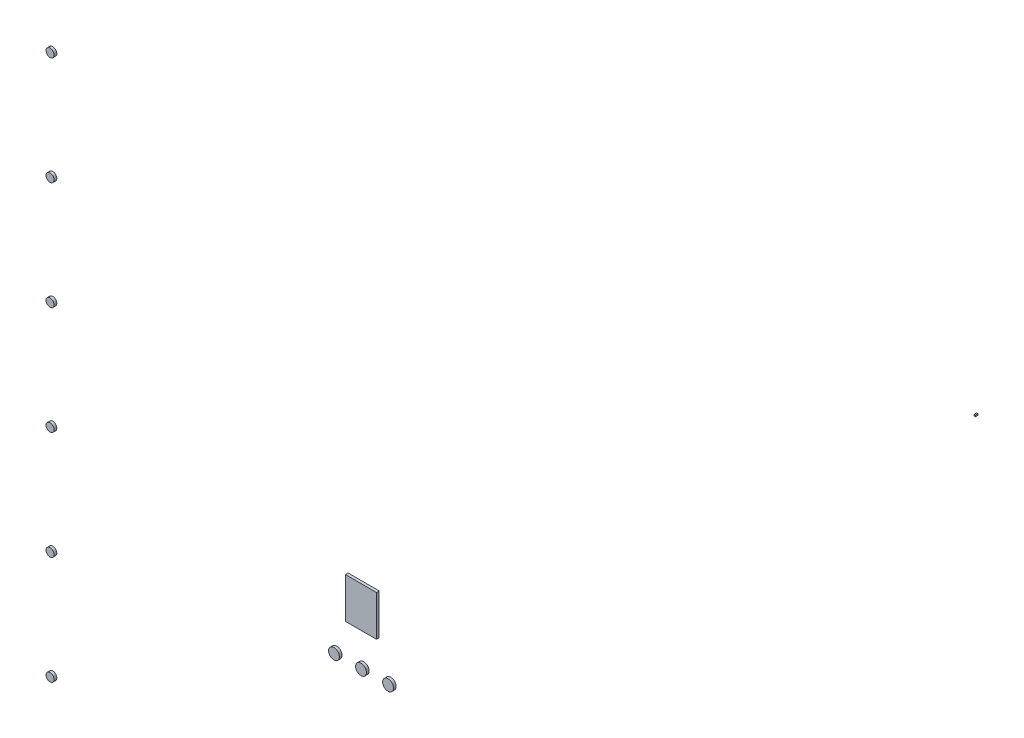
ISO-10303-21;
HEADER;
FILE_DESCRIPTION(('STEP AP214'),'2;1');
FILE_NAME('part.step','',(''),(''),'','','');
FILE_SCHEMA(('AUTOMOTIVE_DESIGN { 1 0 10303 214 1 1 1 1 }'));
ENDSEC;
DATA;
#1=APPLICATION_CONTEXT('core data for automotive mechanical design processes');
#2=APPLICATION_PROTOCOL_DEFINITION('international standard','automotive_design',2000,#1);
#3=PRODUCT_CONTEXT('',#1,'mechanical');
#4=PRODUCT('Part','Part','',(#3));
#5=PRODUCT_RELATED_PRODUCT_CATEGORY('part','',(#4));
#6=PRODUCT_DEFINITION_FORMATION('','',#4);
#7=PRODUCT_DEFINITION_CONTEXT('part definition',#1,'design');
#8=PRODUCT_DEFINITION('design','',#6,#7);
#9=PRODUCT_DEFINITION_SHAPE('','',#8);
#10=(LENGTH_UNIT() NAMED_UNIT(*) SI_UNIT(.MILLI.,.METRE.));
#11=(NAMED_UNIT(*) PLANE_ANGLE_UNIT() SI_UNIT($,.RADIAN.));
#12=(NAMED_UNIT(*) SI_UNIT($,.STERADIAN.) SOLID_ANGLE_UNIT());
#13=UNCERTAINTY_MEASURE_WITH_UNIT(LENGTH_MEASURE(1.E-05),#10,'distance_accuracy_value','');
#14=(GEOMETRIC_REPRESENTATION_CONTEXT(3) GLOBAL_UNCERTAINTY_ASSIGNED_CONTEXT((#13)) GLOBAL_UNIT_ASSIGNED_CONTEXT((#10,
#11,#12)) REPRESENTATION_CONTEXT('',''));
#15=CARTESIAN_POINT('',(0.,0.,0.));
#16=DIRECTION('',(0.,0.,1.));
#17=DIRECTION('',(1.,0.,0.));
#18=AXIS2_PLACEMENT_3D('',#15,#16,#17);
#19=CARTESIAN_POINT('',(0.,569.6,2.));
#20=DIRECTION('',(0.,-1.,0.));
#21=DIRECTION('',(0.,0.,-1.));
#22=AXIS2_PLACEMENT_3D('',#19,#20,#21);
#23=PLANE('',#22);
#24=DIRECTION('',(-1.,0.,0.));
#25=VECTOR('',#24,1.);
#26=CARTESIAN_POINT('',(0.,569.6,0.));
#27=LINE('',#26,#25);
#28=CARTESIAN_POINT('',(924.4,569.6,0.));
#29=VERTEX_POINT('',#28);
#30=CARTESIAN_POINT('',(923.4,569.6,0.));
#31=VERTEX_POINT('',#30);
#32=EDGE_CURVE('E107',#29,#31,#27,.T.);
#33=ORIENTED_EDGE('',*,*,#32,.T.);
#34=DIRECTION('',(0.,0.,-1.));
#35=VECTOR('',#34,1.);
#36=CARTESIAN_POINT('',(923.4,569.6,2.));
#37=LINE('',#36,#35);
#38=CARTESIAN_POINT('',(923.4,569.6,2.));
#39=VERTEX_POINT('',#38);
#40=EDGE_CURVE('E12',#39,#31,#37,.T.);
#41=ORIENTED_EDGE('',*,*,#40,.F.);
#42=DIRECTION('',(-1.,0.,0.));
#43=VECTOR('',#42,1.);
#44=CARTESIAN_POINT('',(0.,569.6,2.));
#45=LINE('',#44,#43);
#46=CARTESIAN_POINT('',(924.4,569.6,2.));
#47=VERTEX_POINT('',#46);
#48=EDGE_CURVE('E93',#47,#39,#45,.T.);
#49=ORIENTED_EDGE('',*,*,#48,.F.);
#50=DIRECTION('',(0.,0.,-1.));
#51=VECTOR('',#50,1.);
#52=CARTESIAN_POINT('',(924.4,569.6,2.));
#53=LINE('',#52,#51);
#54=EDGE_CURVE('E60',#47,#29,#53,.T.);
#55=ORIENTED_EDGE('',*,*,#54,.T.);
#56=EDGE_LOOP('',(#33,#41,#49,#55));
#57=FACE_BOUND('',#56,.T.);
#58=ADVANCED_FACE('F44',(#57),#23,.F.);
#59=CARTESIAN_POINT('',(923.4,0.,2.));
#60=DIRECTION('',(1.,0.,0.));
#61=DIRECTION('',(0.,0.,-1.));
#62=AXIS2_PLACEMENT_3D('',#59,#60,#61);
#63=PLANE('',#62);
#64=DIRECTION('',(0.,-1.,0.));
#65=VECTOR('',#64,1.);
#66=CARTESIAN_POINT('',(923.4,0.,0.));
#67=LINE('',#66,#65);
#68=CARTESIAN_POINT('',(923.4,568.6,0.));
#69=VERTEX_POINT('',#68);
#70=EDGE_CURVE('E98',#31,#69,#67,.T.);
#71=ORIENTED_EDGE('',*,*,#70,.T.);
#72=DIRECTION('',(0.,0.,-1.));
#73=VECTOR('',#72,1.);
#74=CARTESIAN_POINT('',(923.4,568.6,2.));
#75=LINE('',#74,#73);
#76=CARTESIAN_POINT('',(923.4,568.6,2.));
#77=VERTEX_POINT('',#76);
#78=EDGE_CURVE('E52',#77,#69,#75,.T.);
#79=ORIENTED_EDGE('',*,*,#78,.F.);
#80=DIRECTION('',(0.,-1.,0.));
#81=VECTOR('',#80,1.);
#82=CARTESIAN_POINT('',(923.4,0.,2.));
#83=LINE('',#82,#81);
#84=EDGE_CURVE('E85',#39,#77,#83,.T.);
#85=ORIENTED_EDGE('',*,*,#84,.F.);
#86=ORIENTED_EDGE('',*,*,#40,.T.);
#87=EDGE_LOOP('',(#71,#79,#85,#86));
#88=FACE_BOUND('',#87,.T.);
#89=ADVANCED_FACE('F97',(#88),#63,.F.);
#90=CARTESIAN_POINT('',(0.,568.6,2.));
#91=DIRECTION('',(0.,-1.,0.));
#92=DIRECTION('',(0.,0.,-1.));
#93=AXIS2_PLACEMENT_3D('',#90,#91,#92);
#94=PLANE('',#93);
#95=DIRECTION('',(-1.,0.,0.));
#96=VECTOR('',#95,1.);
#97=CARTESIAN_POINT('',(0.,568.6,0.));
#98=LINE('',#97,#96);
#99=CARTESIAN_POINT('',(924.4,568.6,0.));
#100=VERTEX_POINT('',#99);
#101=EDGE_CURVE('E110',#100,#69,#98,.T.);
#102=ORIENTED_EDGE('',*,*,#101,.F.);
#103=DIRECTION('',(0.,0.,-1.));
#104=VECTOR('',#103,1.);
#105=CARTESIAN_POINT('',(924.4,568.6,2.));
#106=LINE('',#105,#104);
#107=CARTESIAN_POINT('',(924.4,568.6,2.));
#108=VERTEX_POINT('',#107);
#109=EDGE_CURVE('E74',#108,#100,#106,.T.);
#110=ORIENTED_EDGE('',*,*,#109,.F.);
#111=DIRECTION('',(-1.,0.,0.));
#112=VECTOR('',#111,1.);
#113=CARTESIAN_POINT('',(0.,568.6,2.));
#114=LINE('',#113,#112);
#115=EDGE_CURVE('E92',#108,#77,#114,.T.);
#116=ORIENTED_EDGE('',*,*,#115,.T.);
#117=ORIENTED_EDGE('',*,*,#78,.T.);
#118=EDGE_LOOP('',(#102,#110,#116,#117));
#119=FACE_BOUND('',#118,.T.);
#120=ADVANCED_FACE('F101',(#119),#94,.T.);
#121=CARTESIAN_POINT('',(924.4,0.,2.));
#122=DIRECTION('',(1.,0.,0.));
#123=DIRECTION('',(0.,0.,-1.));
#124=AXIS2_PLACEMENT_3D('',#121,#122,#123);
#125=PLANE('',#124);
#126=DIRECTION('',(0.,-1.,0.));
#127=VECTOR('',#126,1.);
#128=CARTESIAN_POINT('',(924.4,0.,0.));
#129=LINE('',#128,#127);
#130=EDGE_CURVE('E112',#29,#100,#129,.T.);
#131=ORIENTED_EDGE('',*,*,#130,.F.);
#132=ORIENTED_EDGE('',*,*,#54,.F.);
#133=DIRECTION('',(0.,-1.,0.));
#134=VECTOR('',#133,1.);
#135=CARTESIAN_POINT('',(924.4,0.,2.));
#136=LINE('',#135,#134);
#137=EDGE_CURVE('E102',#47,#108,#136,.T.);
#138=ORIENTED_EDGE('',*,*,#137,.T.);
#139=ORIENTED_EDGE('',*,*,#109,.T.);
#140=EDGE_LOOP('',(#131,#132,#138,#139));
#141=FACE_BOUND('',#140,.T.);
#142=ADVANCED_FACE('F118',(#141),#125,.T.);
#143=CARTESIAN_POINT('',(0.,0.,2.));
#144=DIRECTION('',(0.,0.,1.));
#145=DIRECTION('',(1.,0.,0.));
#146=AXIS2_PLACEMENT_3D('',#143,#144,#145);
#147=PLANE('',#146);
#148=ORIENTED_EDGE('',*,*,#48,.T.);
#149=ORIENTED_EDGE('',*,*,#84,.T.);
#150=ORIENTED_EDGE('',*,*,#115,.F.);
#151=ORIENTED_EDGE('',*,*,#137,.F.);
#152=EDGE_LOOP('',(#148,#149,#150,#151));
#153=FACE_BOUND('',#152,.T.);
#154=ADVANCED_FACE('F89',(#153),#147,.T.);
#155=CARTESIAN_POINT('',(0.,0.,0.));
#156=DIRECTION('',(0.,0.,1.));
#157=DIRECTION('',(1.,0.,0.));
#158=AXIS2_PLACEMENT_3D('',#155,#156,#157);
#159=PLANE('',#158);
#160=ORIENTED_EDGE('',*,*,#32,.F.);
#161=ORIENTED_EDGE('',*,*,#130,.T.);
#162=ORIENTED_EDGE('',*,*,#101,.T.);
#163=ORIENTED_EDGE('',*,*,#70,.F.);
#164=EDGE_LOOP('',(#160,#161,#162,#163));
#165=FACE_BOUND('',#164,.T.);
#166=ADVANCED_FACE('F117',(#165),#159,.F.);
#167=CLOSED_SHELL('',(#58,#89,#120,#142,#154,#166));
#168=MANIFOLD_SOLID_BREP('B2',#167);
#169=CARTESIAN_POINT('',(450.000000000002,179.6,2.));
#170=DIRECTION('',(0.,0.,-1.));
#171=DIRECTION('',(-1.,0.,0.));
#172=AXIS2_PLACEMENT_3D('',#169,#170,#171);
#173=CYLINDRICAL_SURFACE('',#172,3.99999999999999);
#174=CARTESIAN_POINT('',(450.000000000002,179.6,2.));
#175=DIRECTION('',(0.,0.,1.));
#176=DIRECTION('',(1.,0.,0.));
#177=AXIS2_PLACEMENT_3D('',#174,#175,#176);
#178=CIRCLE('',#177,3.99999999999999);
#179=CARTESIAN_POINT('',(454.000000000002,179.6,2.));
#180=VERTEX_POINT('',#179);
#181=EDGE_CURVE('E43',#180,#180,#178,.T.);
#182=ORIENTED_EDGE('',*,*,#181,.F.);
#183=EDGE_LOOP('',(#182));
#184=FACE_BOUND('',#183,.T.);
#185=CARTESIAN_POINT('',(450.000000000002,179.6,0.));
#186=DIRECTION('',(0.,0.,1.));
#187=DIRECTION('',(1.,0.,0.));
#188=AXIS2_PLACEMENT_3D('',#185,#186,#187);
#189=CIRCLE('',#188,3.99999999999999);
#190=CARTESIAN_POINT('',(454.000000000002,179.6,0.));
#191=VERTEX_POINT('',#190);
#192=EDGE_CURVE('E185',#191,#191,#189,.T.);
#193=ORIENTED_EDGE('',*,*,#192,.T.);
#194=EDGE_LOOP('',(#193));
#195=FACE_BOUND('',#194,.T.);
#196=ADVANCED_FACE('F182',(#184,#195),#173,.T.);
#197=CARTESIAN_POINT('',(0.,0.,2.));
#198=DIRECTION('',(0.,0.,1.));
#199=DIRECTION('',(1.,0.,0.));
#200=AXIS2_PLACEMENT_3D('',#197,#198,#199);
#201=PLANE('',#200);
#202=ORIENTED_EDGE('',*,*,#181,.T.);
#203=EDGE_LOOP('',(#202));
#204=FACE_BOUND('',#203,.T.);
#205=ADVANCED_FACE('F197',(#204),#201,.T.);
#206=CARTESIAN_POINT('',(0.,0.,0.));
#207=DIRECTION('',(0.,0.,1.));
#208=DIRECTION('',(1.,0.,0.));
#209=AXIS2_PLACEMENT_3D('',#206,#207,#208);
#210=PLANE('',#209);
#211=ORIENTED_EDGE('',*,*,#192,.F.);
#212=EDGE_LOOP('',(#211));
#213=FACE_BOUND('',#212,.T.);
#214=ADVANCED_FACE('F195',(#213),#210,.F.);
#215=CLOSED_SHELL('',(#196,#205,#214));
#216=MANIFOLD_SOLID_BREP('B6',#215);
#217=CARTESIAN_POINT('',(470.000000000002,179.6,2.));
#218=DIRECTION('',(0.,0.,-1.));
#219=DIRECTION('',(-1.,0.,0.));
#220=AXIS2_PLACEMENT_3D('',#217,#218,#219);
#221=CYLINDRICAL_SURFACE('',#220,3.99999999999999);
#222=CARTESIAN_POINT('',(470.000000000002,179.6,2.));
#223=DIRECTION('',(0.,0.,1.));
#224=DIRECTION('',(1.,0.,0.));
#225=AXIS2_PLACEMENT_3D('',#222,#223,#224);
#226=CIRCLE('',#225,3.99999999999999);
#227=CARTESIAN_POINT('',(474.000000000002,179.6,2.));
#228=VERTEX_POINT('',#227);
#229=EDGE_CURVE('E181',#228,#228,#226,.T.);
#230=ORIENTED_EDGE('',*,*,#229,.F.);
#231=EDGE_LOOP('',(#230));
#232=FACE_BOUND('',#231,.T.);
#233=CARTESIAN_POINT('',(470.000000000002,179.6,0.));
#234=DIRECTION('',(0.,0.,1.));
#235=DIRECTION('',(1.,0.,0.));
#236=AXIS2_PLACEMENT_3D('',#233,#234,#235);
#237=CIRCLE('',#236,3.99999999999999);
#238=CARTESIAN_POINT('',(474.000000000002,179.6,0.));
#239=VERTEX_POINT('',#238);
#240=EDGE_CURVE('E234',#239,#239,#237,.T.);
#241=ORIENTED_EDGE('',*,*,#240,.T.);
#242=EDGE_LOOP('',(#241));
#243=FACE_BOUND('',#242,.T.);
#244=ADVANCED_FACE('F231',(#232,#243),#221,.T.);
#245=CARTESIAN_POINT('',(0.,0.,2.));
#246=DIRECTION('',(0.,0.,1.));
#247=DIRECTION('',(1.,0.,0.));
#248=AXIS2_PLACEMENT_3D('',#245,#246,#247);
#249=PLANE('',#248);
#250=ORIENTED_EDGE('',*,*,#229,.T.);
#251=EDGE_LOOP('',(#250));
#252=FACE_BOUND('',#251,.T.);
#253=ADVANCED_FACE('F246',(#252),#249,.T.);
#254=CARTESIAN_POINT('',(0.,0.,0.));
#255=DIRECTION('',(0.,0.,1.));
#256=DIRECTION('',(1.,0.,0.));
#257=AXIS2_PLACEMENT_3D('',#254,#255,#256);
#258=PLANE('',#257);
#259=ORIENTED_EDGE('',*,*,#240,.F.);
#260=EDGE_LOOP('',(#259));
#261=FACE_BOUND('',#260,.T.);
#262=ADVANCED_FACE('F244',(#261),#258,.F.);
#263=CLOSED_SHELL('',(#244,#253,#262));
#264=MANIFOLD_SOLID_BREP('B38',#263);
#265=CARTESIAN_POINT('',(490.000000000002,179.6,2.));
#266=DIRECTION('',(0.,0.,-1.));
#267=DIRECTION('',(-1.,0.,0.));
#268=AXIS2_PLACEMENT_3D('',#265,#266,#267);
#269=CYLINDRICAL_SURFACE('',#268,3.99999999999999);
#270=CARTESIAN_POINT('',(490.000000000002,179.6,2.));
#271=DIRECTION('',(0.,0.,1.));
#272=DIRECTION('',(1.,0.,0.));
#273=AXIS2_PLACEMENT_3D('',#270,#271,#272);
#274=CIRCLE('',#273,3.99999999999999);
#275=CARTESIAN_POINT('',(494.000000000002,179.6,2.));
#276=VERTEX_POINT('',#275);
#277=EDGE_CURVE('E230',#276,#276,#274,.T.);
#278=ORIENTED_EDGE('',*,*,#277,.F.);
#279=EDGE_LOOP('',(#278));
#280=FACE_BOUND('',#279,.T.);
#281=CARTESIAN_POINT('',(490.000000000002,179.6,0.));
#282=DIRECTION('',(0.,0.,1.));
#283=DIRECTION('',(1.,0.,0.));
#284=AXIS2_PLACEMENT_3D('',#281,#282,#283);
#285=CIRCLE('',#284,3.99999999999999);
#286=CARTESIAN_POINT('',(494.000000000002,179.6,0.));
#287=VERTEX_POINT('',#286);
#288=EDGE_CURVE('E285',#287,#287,#285,.T.);
#289=ORIENTED_EDGE('',*,*,#288,.T.);
#290=EDGE_LOOP('',(#289));
#291=FACE_BOUND('',#290,.T.);
#292=ADVANCED_FACE('F282',(#280,#291),#269,.T.);
#293=CARTESIAN_POINT('',(0.,0.,2.));
#294=DIRECTION('',(0.,0.,1.));
#295=DIRECTION('',(1.,0.,0.));
#296=AXIS2_PLACEMENT_3D('',#293,#294,#295);
#297=PLANE('',#296);
#298=ORIENTED_EDGE('',*,*,#277,.T.);
#299=EDGE_LOOP('',(#298));
#300=FACE_BOUND('',#299,.T.);
#301=ADVANCED_FACE('F297',(#300),#297,.T.);
#302=CARTESIAN_POINT('',(0.,0.,0.));
#303=DIRECTION('',(0.,0.,1.));
#304=DIRECTION('',(1.,0.,0.));
#305=AXIS2_PLACEMENT_3D('',#302,#303,#304);
#306=PLANE('',#305);
#307=ORIENTED_EDGE('',*,*,#288,.F.);
#308=EDGE_LOOP('',(#307));
#309=FACE_BOUND('',#308,.T.);
#310=ADVANCED_FACE('F295',(#309),#306,.F.);
#311=CLOSED_SHELL('',(#292,#301,#310));
#312=MANIFOLD_SOLID_BREP('B176',#311);
#313=CARTESIAN_POINT('',(481.500000000002,0.,2.));
#314=DIRECTION('',(-1.,0.,0.));
#315=DIRECTION('',(0.,0.,1.));
#316=AXIS2_PLACEMENT_3D('',#313,#314,#315);
#317=PLANE('',#316);
#318=DIRECTION('',(0.,1.,0.));
#319=VECTOR('',#318,1.);
#320=CARTESIAN_POINT('',(481.500000000002,0.,0.));
#321=LINE('',#320,#319);
#322=CARTESIAN_POINT('',(481.500000000002,204.6,0.));
#323=VERTEX_POINT('',#322);
#324=CARTESIAN_POINT('',(481.500000000002,234.6,0.));
#325=VERTEX_POINT('',#324);
#326=EDGE_CURVE('E394',#323,#325,#321,.T.);
#327=ORIENTED_EDGE('',*,*,#326,.T.);
#328=DIRECTION('',(0.,0.,-1.));
#329=VECTOR('',#328,1.);
#330=CARTESIAN_POINT('',(481.500000000002,234.6,2.));
#331=LINE('',#330,#329);
#332=CARTESIAN_POINT('',(481.500000000002,234.6,2.));
#333=VERTEX_POINT('',#332);
#334=EDGE_CURVE('E280',#333,#325,#331,.T.);
#335=ORIENTED_EDGE('',*,*,#334,.F.);
#336=DIRECTION('',(0.,1.,0.));
#337=VECTOR('',#336,1.);
#338=CARTESIAN_POINT('',(481.500000000002,0.,2.));
#339=LINE('',#338,#337);
#340=CARTESIAN_POINT('',(481.500000000002,204.6,2.));
#341=VERTEX_POINT('',#340);
#342=EDGE_CURVE('E382',#341,#333,#339,.T.);
#343=ORIENTED_EDGE('',*,*,#342,.F.);
#344=DIRECTION('',(0.,0.,-1.));
#345=VECTOR('',#344,1.);
#346=CARTESIAN_POINT('',(481.500000000002,204.6,2.));
#347=LINE('',#346,#345);
#348=EDGE_CURVE('E390',#341,#323,#347,.T.);
#349=ORIENTED_EDGE('',*,*,#348,.T.);
#350=EDGE_LOOP('',(#327,#335,#343,#349));
#351=FACE_BOUND('',#350,.T.);
#352=ADVANCED_FACE('F331',(#351),#317,.F.);
#353=CARTESIAN_POINT('',(0.,234.6,2.));
#354=DIRECTION('',(0.,-1.,0.));
#355=DIRECTION('',(0.,0.,-1.));
#356=AXIS2_PLACEMENT_3D('',#353,#354,#355);
#357=PLANE('',#356);
#358=DIRECTION('',(-1.,0.,0.));
#359=VECTOR('',#358,1.);
#360=CARTESIAN_POINT('',(0.,234.6,0.));
#361=LINE('',#360,#359);
#362=CARTESIAN_POINT('',(458.500000000002,234.6,0.));
#363=VERTEX_POINT('',#362);
#364=EDGE_CURVE('E386',#325,#363,#361,.T.);
#365=ORIENTED_EDGE('',*,*,#364,.T.);
#366=DIRECTION('',(0.,0.,-1.));
#367=VECTOR('',#366,1.);
#368=CARTESIAN_POINT('',(458.500000000002,234.6,2.));
#369=LINE('',#368,#367);
#370=CARTESIAN_POINT('',(458.500000000002,234.6,2.));
#371=VERTEX_POINT('',#370);
#372=EDGE_CURVE('E339',#371,#363,#369,.T.);
#373=ORIENTED_EDGE('',*,*,#372,.F.);
#374=DIRECTION('',(-1.,0.,0.));
#375=VECTOR('',#374,1.);
#376=CARTESIAN_POINT('',(0.,234.6,2.));
#377=LINE('',#376,#375);
#378=EDGE_CURVE('E377',#333,#371,#377,.T.);
#379=ORIENTED_EDGE('',*,*,#378,.F.);
#380=ORIENTED_EDGE('',*,*,#334,.T.);
#381=EDGE_LOOP('',(#365,#373,#379,#380));
#382=FACE_BOUND('',#381,.T.);
#383=ADVANCED_FACE('F385',(#382),#357,.F.);
#384=CARTESIAN_POINT('',(458.500000000002,0.,2.));
#385=DIRECTION('',(1.,0.,0.));
#386=DIRECTION('',(0.,0.,-1.));
#387=AXIS2_PLACEMENT_3D('',#384,#385,#386);
#388=PLANE('',#387);
#389=DIRECTION('',(0.,-1.,0.));
#390=VECTOR('',#389,1.);
#391=CARTESIAN_POINT('',(458.500000000002,0.,0.));
#392=LINE('',#391,#390);
#393=CARTESIAN_POINT('',(458.500000000002,204.6,0.));
#394=VERTEX_POINT('',#393);
#395=EDGE_CURVE('E364',#363,#394,#392,.T.);
#396=ORIENTED_EDGE('',*,*,#395,.T.);
#397=DIRECTION('',(0.,0.,-1.));
#398=VECTOR('',#397,1.);
#399=CARTESIAN_POINT('',(458.500000000002,204.6,2.));
#400=LINE('',#399,#398);
#401=CARTESIAN_POINT('',(458.500000000002,204.6,2.));
#402=VERTEX_POINT('',#401);
#403=EDGE_CURVE('E387',#402,#394,#400,.T.);
#404=ORIENTED_EDGE('',*,*,#403,.F.);
#405=DIRECTION('',(0.,-1.,0.));
#406=VECTOR('',#405,1.);
#407=CARTESIAN_POINT('',(458.500000000002,0.,2.));
#408=LINE('',#407,#406);
#409=EDGE_CURVE('E380',#371,#402,#408,.T.);
#410=ORIENTED_EDGE('',*,*,#409,.F.);
#411=ORIENTED_EDGE('',*,*,#372,.T.);
#412=EDGE_LOOP('',(#396,#404,#410,#411));
#413=FACE_BOUND('',#412,.T.);
#414=ADVANCED_FACE('F388',(#413),#388,.F.);
#415=CARTESIAN_POINT('',(0.,204.6,2.));
#416=DIRECTION('',(0.,1.,0.));
#417=DIRECTION('',(0.,0.,1.));
#418=AXIS2_PLACEMENT_3D('',#415,#416,#417);
#419=PLANE('',#418);
#420=DIRECTION('',(1.,0.,0.));
#421=VECTOR('',#420,1.);
#422=CARTESIAN_POINT('',(0.,204.6,0.));
#423=LINE('',#422,#421);
#424=EDGE_CURVE('E370',#394,#323,#423,.T.);
#425=ORIENTED_EDGE('',*,*,#424,.T.);
#426=ORIENTED_EDGE('',*,*,#348,.F.);
#427=DIRECTION('',(1.,0.,0.));
#428=VECTOR('',#427,1.);
#429=CARTESIAN_POINT('',(0.,204.6,2.));
#430=LINE('',#429,#428);
#431=EDGE_CURVE('E347',#402,#341,#430,.T.);
#432=ORIENTED_EDGE('',*,*,#431,.F.);
#433=ORIENTED_EDGE('',*,*,#403,.T.);
#434=EDGE_LOOP('',(#425,#426,#432,#433));
#435=FACE_BOUND('',#434,.T.);
#436=ADVANCED_FACE('F401',(#435),#419,.F.);
#437=CARTESIAN_POINT('',(0.,0.,2.));
#438=DIRECTION('',(0.,0.,1.));
#439=DIRECTION('',(1.,0.,0.));
#440=AXIS2_PLACEMENT_3D('',#437,#438,#439);
#441=PLANE('',#440);
#442=ORIENTED_EDGE('',*,*,#342,.T.);
#443=ORIENTED_EDGE('',*,*,#378,.T.);
#444=ORIENTED_EDGE('',*,*,#409,.T.);
#445=ORIENTED_EDGE('',*,*,#431,.T.);
#446=EDGE_LOOP('',(#442,#443,#444,#445));
#447=FACE_BOUND('',#446,.T.);
#448=ADVANCED_FACE('F378',(#447),#441,.T.);
#449=CARTESIAN_POINT('',(0.,0.,0.));
#450=DIRECTION('',(0.,0.,1.));
#451=DIRECTION('',(1.,0.,0.));
#452=AXIS2_PLACEMENT_3D('',#449,#450,#451);
#453=PLANE('',#452);
#454=ORIENTED_EDGE('',*,*,#326,.F.);
#455=ORIENTED_EDGE('',*,*,#424,.F.);
#456=ORIENTED_EDGE('',*,*,#395,.F.);
#457=ORIENTED_EDGE('',*,*,#364,.F.);
#458=EDGE_LOOP('',(#454,#455,#456,#457));
#459=FACE_BOUND('',#458,.T.);
#460=ADVANCED_FACE('F404',(#459),#453,.F.);
#461=CLOSED_SHELL('',(#352,#383,#414,#436,#448,#460));
#462=MANIFOLD_SOLID_BREP('B225',#461);
#463=CARTESIAN_POINT('',(240.000000000004,59.6,2.));
#464=DIRECTION('',(0.,0.,-1.));
#465=DIRECTION('',(-1.,0.,0.));
#466=AXIS2_PLACEMENT_3D('',#463,#464,#465);
#467=CYLINDRICAL_SURFACE('',#466,2.99999999999999);
#468=CARTESIAN_POINT('',(240.000000000004,59.6,2.));
#469=DIRECTION('',(0.,0.,1.));
#470=DIRECTION('',(1.,0.,0.));
#471=AXIS2_PLACEMENT_3D('',#468,#469,#470);
#472=CIRCLE('',#471,2.99999999999999);
#473=CARTESIAN_POINT('',(243.000000000004,59.6,2.));
#474=VERTEX_POINT('',#473);
#475=EDGE_CURVE('E330',#474,#474,#472,.T.);
#476=ORIENTED_EDGE('',*,*,#475,.F.);
#477=EDGE_LOOP('',(#476));
#478=FACE_BOUND('',#477,.T.);
#479=CARTESIAN_POINT('',(240.000000000004,59.6,0.));
#480=DIRECTION('',(0.,0.,1.));
#481=DIRECTION('',(1.,0.,0.));
#482=AXIS2_PLACEMENT_3D('',#479,#480,#481);
#483=CIRCLE('',#482,2.99999999999999);
#484=CARTESIAN_POINT('',(243.000000000004,59.6,0.));
#485=VERTEX_POINT('',#484);
#486=EDGE_CURVE('E466',#485,#485,#483,.T.);
#487=ORIENTED_EDGE('',*,*,#486,.T.);
#488=EDGE_LOOP('',(#487));
#489=FACE_BOUND('',#488,.T.);
#490=ADVANCED_FACE('F463',(#478,#489),#467,.T.);
#491=CARTESIAN_POINT('',(0.,0.,2.));
#492=DIRECTION('',(0.,0.,1.));
#493=DIRECTION('',(1.,0.,0.));
#494=AXIS2_PLACEMENT_3D('',#491,#492,#493);
#495=PLANE('',#494);
#496=ORIENTED_EDGE('',*,*,#475,.T.);
#497=EDGE_LOOP('',(#496));
#498=FACE_BOUND('',#497,.T.);
#499=ADVANCED_FACE('F478',(#498),#495,.T.);
#500=CARTESIAN_POINT('',(0.,0.,0.));
#501=DIRECTION('',(0.,0.,1.));
#502=DIRECTION('',(1.,0.,0.));
#503=AXIS2_PLACEMENT_3D('',#500,#501,#502);
#504=PLANE('',#503);
#505=ORIENTED_EDGE('',*,*,#486,.F.);
#506=EDGE_LOOP('',(#505));
#507=FACE_BOUND('',#506,.T.);
#508=ADVANCED_FACE('F476',(#507),#504,.F.);
#509=CLOSED_SHELL('',(#490,#499,#508));
#510=MANIFOLD_SOLID_BREP('B274',#509);
#511=CARTESIAN_POINT('',(240.000000000003,139.6,2.));
#512=DIRECTION('',(0.,0.,-1.));
#513=DIRECTION('',(-1.,0.,0.));
#514=AXIS2_PLACEMENT_3D('',#511,#512,#513);
#515=CYLINDRICAL_SURFACE('',#514,2.99999999999999);
#516=CARTESIAN_POINT('',(240.000000000003,139.6,2.));
#517=DIRECTION('',(0.,0.,1.));
#518=DIRECTION('',(1.,0.,0.));
#519=AXIS2_PLACEMENT_3D('',#516,#517,#518);
#520=CIRCLE('',#519,2.99999999999999);
#521=CARTESIAN_POINT('',(243.000000000003,139.6,2.));
#522=VERTEX_POINT('',#521);
#523=EDGE_CURVE('E462',#522,#522,#520,.T.);
#524=ORIENTED_EDGE('',*,*,#523,.F.);
#525=EDGE_LOOP('',(#524));
#526=FACE_BOUND('',#525,.T.);
#527=CARTESIAN_POINT('',(240.000000000003,139.6,0.));
#528=DIRECTION('',(0.,0.,1.));
#529=DIRECTION('',(1.,0.,0.));
#530=AXIS2_PLACEMENT_3D('',#527,#528,#529);
#531=CIRCLE('',#530,2.99999999999999);
#532=CARTESIAN_POINT('',(243.000000000003,139.6,0.));
#533=VERTEX_POINT('',#532);
#534=EDGE_CURVE('E515',#533,#533,#531,.T.);
#535=ORIENTED_EDGE('',*,*,#534,.T.);
#536=EDGE_LOOP('',(#535));
#537=FACE_BOUND('',#536,.T.);
#538=ADVANCED_FACE('F512',(#526,#537),#515,.T.);
#539=CARTESIAN_POINT('',(0.,0.,2.));
#540=DIRECTION('',(0.,0.,1.));
#541=DIRECTION('',(1.,0.,0.));
#542=AXIS2_PLACEMENT_3D('',#539,#540,#541);
#543=PLANE('',#542);
#544=ORIENTED_EDGE('',*,*,#523,.T.);
#545=EDGE_LOOP('',(#544));
#546=FACE_BOUND('',#545,.T.);
#547=ADVANCED_FACE('F527',(#546),#543,.T.);
#548=CARTESIAN_POINT('',(0.,0.,0.));
#549=DIRECTION('',(0.,0.,1.));
#550=DIRECTION('',(1.,0.,0.));
#551=AXIS2_PLACEMENT_3D('',#548,#549,#550);
#552=PLANE('',#551);
#553=ORIENTED_EDGE('',*,*,#534,.F.);
#554=EDGE_LOOP('',(#553));
#555=FACE_BOUND('',#554,.T.);
#556=ADVANCED_FACE('F525',(#555),#552,.F.);
#557=CLOSED_SHELL('',(#538,#547,#556));
#558=MANIFOLD_SOLID_BREP('B325',#557);
#559=CARTESIAN_POINT('',(240.000000000003,219.6,2.));
#560=DIRECTION('',(0.,0.,-1.));
#561=DIRECTION('',(-1.,0.,0.));
#562=AXIS2_PLACEMENT_3D('',#559,#560,#561);
#563=CYLINDRICAL_SURFACE('',#562,2.99999999999999);
#564=CARTESIAN_POINT('',(240.000000000003,219.6,2.));
#565=DIRECTION('',(0.,0.,1.));
#566=DIRECTION('',(1.,0.,0.));
#567=AXIS2_PLACEMENT_3D('',#564,#565,#566);
#568=CIRCLE('',#567,2.99999999999999);
#569=CARTESIAN_POINT('',(243.000000000003,219.6,2.));
#570=VERTEX_POINT('',#569);
#571=EDGE_CURVE('E511',#570,#570,#568,.T.);
#572=ORIENTED_EDGE('',*,*,#571,.F.);
#573=EDGE_LOOP('',(#572));
#574=FACE_BOUND('',#573,.T.);
#575=CARTESIAN_POINT('',(240.000000000003,219.6,0.));
#576=DIRECTION('',(0.,0.,1.));
#577=DIRECTION('',(1.,0.,0.));
#578=AXIS2_PLACEMENT_3D('',#575,#576,#577);
#579=CIRCLE('',#578,2.99999999999999);
#580=CARTESIAN_POINT('',(243.000000000003,219.6,0.));
#581=VERTEX_POINT('',#580);
#582=EDGE_CURVE('E564',#581,#581,#579,.T.);
#583=ORIENTED_EDGE('',*,*,#582,.T.);
#584=EDGE_LOOP('',(#583));
#585=FACE_BOUND('',#584,.T.);
#586=ADVANCED_FACE('F561',(#574,#585),#563,.T.);
#587=CARTESIAN_POINT('',(0.,0.,2.));
#588=DIRECTION('',(0.,0.,1.));
#589=DIRECTION('',(1.,0.,0.));
#590=AXIS2_PLACEMENT_3D('',#587,#588,#589);
#591=PLANE('',#590);
#592=ORIENTED_EDGE('',*,*,#571,.T.);
#593=EDGE_LOOP('',(#592));
#594=FACE_BOUND('',#593,.T.);
#595=ADVANCED_FACE('F576',(#594),#591,.T.);
#596=CARTESIAN_POINT('',(0.,0.,0.));
#597=DIRECTION('',(0.,0.,1.));
#598=DIRECTION('',(1.,0.,0.));
#599=AXIS2_PLACEMENT_3D('',#596,#597,#598);
#600=PLANE('',#599);
#601=ORIENTED_EDGE('',*,*,#582,.F.);
#602=EDGE_LOOP('',(#601));
#603=FACE_BOUND('',#602,.T.);
#604=ADVANCED_FACE('F574',(#603),#600,.F.);
#605=CLOSED_SHELL('',(#586,#595,#604));
#606=MANIFOLD_SOLID_BREP('B457',#605);
#607=CARTESIAN_POINT('',(240.,459.6,2.));
#608=DIRECTION('',(0.,0.,-1.));
#609=DIRECTION('',(-1.,0.,0.));
#610=AXIS2_PLACEMENT_3D('',#607,#608,#609);
#611=CYLINDRICAL_SURFACE('',#610,2.99999999999999);
#612=CARTESIAN_POINT('',(240.,459.6,2.));
#613=DIRECTION('',(0.,0.,1.));
#614=DIRECTION('',(1.,0.,0.));
#615=AXIS2_PLACEMENT_3D('',#612,#613,#614);
#616=CIRCLE('',#615,2.99999999999999);
#617=CARTESIAN_POINT('',(243.,459.6,2.));
#618=VERTEX_POINT('',#617);
#619=EDGE_CURVE('E560',#618,#618,#616,.T.);
#620=ORIENTED_EDGE('',*,*,#619,.F.);
#621=EDGE_LOOP('',(#620));
#622=FACE_BOUND('',#621,.T.);
#623=CARTESIAN_POINT('',(240.,459.6,0.));
#624=DIRECTION('',(0.,0.,1.));
#625=DIRECTION('',(1.,0.,0.));
#626=AXIS2_PLACEMENT_3D('',#623,#624,#625);
#627=CIRCLE('',#626,2.99999999999999);
#628=CARTESIAN_POINT('',(243.,459.6,0.));
#629=VERTEX_POINT('',#628);
#630=EDGE_CURVE('E613',#629,#629,#627,.T.);
#631=ORIENTED_EDGE('',*,*,#630,.T.);
#632=EDGE_LOOP('',(#631));
#633=FACE_BOUND('',#632,.T.);
#634=ADVANCED_FACE('F610',(#622,#633),#611,.T.);
#635=CARTESIAN_POINT('',(0.,0.,2.));
#636=DIRECTION('',(0.,0.,1.));
#637=DIRECTION('',(1.,0.,0.));
#638=AXIS2_PLACEMENT_3D('',#635,#636,#637);
#639=PLANE('',#638);
#640=ORIENTED_EDGE('',*,*,#619,.T.);
#641=EDGE_LOOP('',(#640));
#642=FACE_BOUND('',#641,.T.);
#643=ADVANCED_FACE('F625',(#642),#639,.T.);
#644=CARTESIAN_POINT('',(0.,0.,0.));
#645=DIRECTION('',(0.,0.,1.));
#646=DIRECTION('',(1.,0.,0.));
#647=AXIS2_PLACEMENT_3D('',#644,#645,#646);
#648=PLANE('',#647);
#649=ORIENTED_EDGE('',*,*,#630,.F.);
#650=EDGE_LOOP('',(#649));
#651=FACE_BOUND('',#650,.T.);
#652=ADVANCED_FACE('F623',(#651),#648,.F.);
#653=CLOSED_SHELL('',(#634,#643,#652));
#654=MANIFOLD_SOLID_BREP('B506',#653);
#655=CARTESIAN_POINT('',(240.000000000001,379.6,2.));
#656=DIRECTION('',(0.,0.,-1.));
#657=DIRECTION('',(-1.,0.,0.));
#658=AXIS2_PLACEMENT_3D('',#655,#656,#657);
#659=CYLINDRICAL_SURFACE('',#658,2.99999999999999);
#660=CARTESIAN_POINT('',(240.000000000001,379.6,2.));
#661=DIRECTION('',(0.,0.,1.));
#662=DIRECTION('',(1.,0.,0.));
#663=AXIS2_PLACEMENT_3D('',#660,#661,#662);
#664=CIRCLE('',#663,2.99999999999999);
#665=CARTESIAN_POINT('',(243.000000000001,379.6,2.));
#666=VERTEX_POINT('',#665);
#667=EDGE_CURVE('E609',#666,#666,#664,.T.);
#668=ORIENTED_EDGE('',*,*,#667,.F.);
#669=EDGE_LOOP('',(#668));
#670=FACE_BOUND('',#669,.T.);
#671=CARTESIAN_POINT('',(240.000000000001,379.6,0.));
#672=DIRECTION('',(0.,0.,1.));
#673=DIRECTION('',(1.,0.,0.));
#674=AXIS2_PLACEMENT_3D('',#671,#672,#673);
#675=CIRCLE('',#674,2.99999999999999);
#676=CARTESIAN_POINT('',(243.000000000001,379.6,0.));
#677=VERTEX_POINT('',#676);
#678=EDGE_CURVE('E661',#677,#677,#675,.T.);
#679=ORIENTED_EDGE('',*,*,#678,.T.);
#680=EDGE_LOOP('',(#679));
#681=FACE_BOUND('',#680,.T.);
#682=ADVANCED_FACE('F658',(#670,#681),#659,.T.);
#683=CARTESIAN_POINT('',(0.,0.,2.));
#684=DIRECTION('',(0.,0.,1.));
#685=DIRECTION('',(1.,0.,0.));
#686=AXIS2_PLACEMENT_3D('',#683,#684,#685);
#687=PLANE('',#686);
#688=ORIENTED_EDGE('',*,*,#667,.T.);
#689=EDGE_LOOP('',(#688));
#690=FACE_BOUND('',#689,.T.);
#691=ADVANCED_FACE('F673',(#690),#687,.T.);
#692=CARTESIAN_POINT('',(0.,0.,0.));
#693=DIRECTION('',(0.,0.,1.));
#694=DIRECTION('',(1.,0.,0.));
#695=AXIS2_PLACEMENT_3D('',#692,#693,#694);
#696=PLANE('',#695);
#697=ORIENTED_EDGE('',*,*,#678,.F.);
#698=EDGE_LOOP('',(#697));
#699=FACE_BOUND('',#698,.T.);
#700=ADVANCED_FACE('F671',(#699),#696,.F.);
#701=CLOSED_SHELL('',(#682,#691,#700));
#702=MANIFOLD_SOLID_BREP('B555',#701);
#703=CARTESIAN_POINT('',(240.000000000002,299.6,2.));
#704=DIRECTION('',(0.,0.,-1.));
#705=DIRECTION('',(-1.,0.,0.));
#706=AXIS2_PLACEMENT_3D('',#703,#704,#705);
#707=CYLINDRICAL_SURFACE('',#706,2.99999999999999);
#708=CARTESIAN_POINT('',(240.000000000002,299.6,2.));
#709=DIRECTION('',(0.,0.,1.));
#710=DIRECTION('',(1.,0.,0.));
#711=AXIS2_PLACEMENT_3D('',#708,#709,#710);
#712=CIRCLE('',#711,2.99999999999999);
#713=CARTESIAN_POINT('',(243.000000000002,299.6,2.));
#714=VERTEX_POINT('',#713);
#715=EDGE_CURVE('E657',#714,#714,#712,.T.);
#716=ORIENTED_EDGE('',*,*,#715,.F.);
#717=EDGE_LOOP('',(#716));
#718=FACE_BOUND('',#717,.T.);
#719=CARTESIAN_POINT('',(240.000000000002,299.6,0.));
#720=DIRECTION('',(0.,0.,1.));
#721=DIRECTION('',(1.,0.,0.));
#722=AXIS2_PLACEMENT_3D('',#719,#720,#721);
#723=CIRCLE('',#722,2.99999999999999);
#724=CARTESIAN_POINT('',(243.000000000002,299.6,0.));
#725=VERTEX_POINT('',#724);
#726=EDGE_CURVE('E702',#725,#725,#723,.T.);
#727=ORIENTED_EDGE('',*,*,#726,.T.);
#728=EDGE_LOOP('',(#727));
#729=FACE_BOUND('',#728,.T.);
#730=ADVANCED_FACE('F699',(#718,#729),#707,.T.);
#731=CARTESIAN_POINT('',(0.,0.,2.));
#732=DIRECTION('',(0.,0.,1.));
#733=DIRECTION('',(1.,0.,0.));
#734=AXIS2_PLACEMENT_3D('',#731,#732,#733);
#735=PLANE('',#734);
#736=ORIENTED_EDGE('',*,*,#715,.T.);
#737=EDGE_LOOP('',(#736));
#738=FACE_BOUND('',#737,.T.);
#739=ADVANCED_FACE('F714',(#738),#735,.T.);
#740=CARTESIAN_POINT('',(0.,0.,0.));
#741=DIRECTION('',(0.,0.,1.));
#742=DIRECTION('',(1.,0.,0.));
#743=AXIS2_PLACEMENT_3D('',#740,#741,#742);
#744=PLANE('',#743);
#745=ORIENTED_EDGE('',*,*,#726,.F.);
#746=EDGE_LOOP('',(#745));
#747=FACE_BOUND('',#746,.T.);
#748=ADVANCED_FACE('F712',(#747),#744,.F.);
#749=CLOSED_SHELL('',(#730,#739,#748));
#750=MANIFOLD_SOLID_BREP('B604',#749);
#751=ADVANCED_BREP_SHAPE_REPRESENTATION('',(#18,#168,#216,#264,#312,#462,#510,#558,#606,#654,
#702,#750),#14);
#752=SHAPE_DEFINITION_REPRESENTATION(#9,#751);
ENDSEC;
END-ISO-10303-21;
